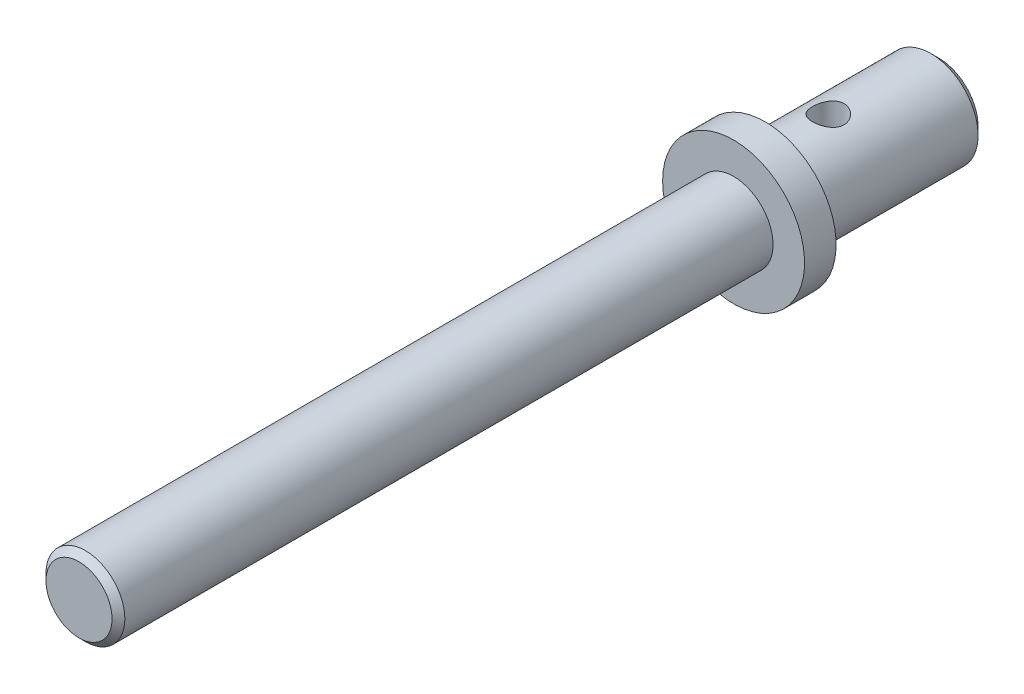
ISO-10303-21;
HEADER;
FILE_DESCRIPTION(('STEP AP214'),'2;1');
FILE_NAME('part.step','',(''),(''),'','','');
FILE_SCHEMA(('AUTOMOTIVE_DESIGN { 1 0 10303 214 1 1 1 1 }'));
ENDSEC;
DATA;
#1=APPLICATION_CONTEXT('core data for automotive mechanical design processes');
#2=APPLICATION_PROTOCOL_DEFINITION('international standard','automotive_design',2000,#1);
#3=PRODUCT_CONTEXT('',#1,'mechanical');
#4=PRODUCT('Part','Part','',(#3));
#5=PRODUCT_RELATED_PRODUCT_CATEGORY('part','',(#4));
#6=PRODUCT_DEFINITION_FORMATION('','',#4);
#7=PRODUCT_DEFINITION_CONTEXT('part definition',#1,'design');
#8=PRODUCT_DEFINITION('design','',#6,#7);
#9=PRODUCT_DEFINITION_SHAPE('','',#8);
#10=(LENGTH_UNIT() NAMED_UNIT(*) SI_UNIT(.MILLI.,.METRE.));
#11=(NAMED_UNIT(*) PLANE_ANGLE_UNIT() SI_UNIT($,.RADIAN.));
#12=(NAMED_UNIT(*) SI_UNIT($,.STERADIAN.) SOLID_ANGLE_UNIT());
#13=UNCERTAINTY_MEASURE_WITH_UNIT(LENGTH_MEASURE(1.E-05),#10,'distance_accuracy_value','');
#14=(GEOMETRIC_REPRESENTATION_CONTEXT(3) GLOBAL_UNCERTAINTY_ASSIGNED_CONTEXT((#13)) GLOBAL_UNIT_ASSIGNED_CONTEXT((#10,
#11,#12)) REPRESENTATION_CONTEXT('',''));
#15=CARTESIAN_POINT('',(0.,0.,0.));
#16=DIRECTION('',(0.,0.,1.));
#17=DIRECTION('',(1.,0.,0.));
#18=AXIS2_PLACEMENT_3D('',#15,#16,#17);
#19=CARTESIAN_POINT('',(0.,0.,-83.));
#20=DIRECTION('',(0.,0.,1.));
#21=DIRECTION('',(1.,0.,0.));
#22=AXIS2_PLACEMENT_3D('',#19,#20,#21);
#23=CYLINDRICAL_SURFACE('',#22,5.);
#24=CARTESIAN_POINT('',(0.,0.,-0.811999999999986));
#25=DIRECTION('',(0.,0.,-1.));
#26=DIRECTION('',(-1.,0.,0.));
#27=AXIS2_PLACEMENT_3D('',#24,#25,#26);
#28=CIRCLE('',#27,5.);
#29=CARTESIAN_POINT('',(-5.,0.,-0.811999999999986));
#30=VERTEX_POINT('',#29);
#31=EDGE_CURVE('E68',#30,#30,#28,.T.);
#32=ORIENTED_EDGE('',*,*,#31,.T.);
#33=EDGE_LOOP('',(#32));
#34=FACE_BOUND('',#33,.T.);
#35=CARTESIAN_POINT('',(0.,0.,-83.));
#36=DIRECTION('',(0.,0.,1.));
#37=DIRECTION('',(1.,0.,0.));
#38=AXIS2_PLACEMENT_3D('',#35,#36,#37);
#39=CIRCLE('',#38,5.);
#40=CARTESIAN_POINT('',(5.,0.,-83.));
#41=VERTEX_POINT('',#40);
#42=EDGE_CURVE('E134',#41,#41,#39,.T.);
#43=ORIENTED_EDGE('',*,*,#42,.T.);
#44=EDGE_LOOP('',(#43));
#45=FACE_BOUND('',#44,.T.);
#46=ADVANCED_FACE('F49',(#34,#45),#23,.T.);
#47=CARTESIAN_POINT('',(0.,0.,0.));
#48=DIRECTION('',(0.,0.,-1.));
#49=DIRECTION('',(-1.,0.,0.));
#50=AXIS2_PLACEMENT_3D('',#47,#48,#49);
#51=CONICAL_SURFACE('',#50,4.188,0.785398163397455);
#52=ORIENTED_EDGE('',*,*,#31,.F.);
#53=EDGE_LOOP('',(#52));
#54=FACE_BOUND('',#53,.T.);
#55=CARTESIAN_POINT('',(0.,0.,0.));
#56=DIRECTION('',(0.,0.,-1.));
#57=DIRECTION('',(-1.,0.,0.));
#58=AXIS2_PLACEMENT_3D('',#55,#56,#57);
#59=CIRCLE('',#58,4.188);
#60=CARTESIAN_POINT('',(-4.188,0.,0.));
#61=VERTEX_POINT('',#60);
#62=EDGE_CURVE('E139',#61,#61,#59,.T.);
#63=ORIENTED_EDGE('',*,*,#62,.T.);
#64=EDGE_LOOP('',(#63));
#65=FACE_BOUND('',#64,.T.);
#66=ADVANCED_FACE('F103',(#54,#65),#51,.T.);
#67=CARTESIAN_POINT('',(0.,0.,0.));
#68=DIRECTION('',(0.,0.,1.));
#69=DIRECTION('',(1.,0.,0.));
#70=AXIS2_PLACEMENT_3D('',#67,#68,#69);
#71=PLANE('',#70);
#72=ORIENTED_EDGE('',*,*,#62,.F.);
#73=EDGE_LOOP('',(#72));
#74=FACE_BOUND('',#73,.T.);
#75=ADVANCED_FACE('F108',(#74),#71,.T.);
#76=CARTESIAN_POINT('',(0.,0.,-87.));
#77=DIRECTION('',(0.,0.,1.));
#78=DIRECTION('',(1.,0.,0.));
#79=AXIS2_PLACEMENT_3D('',#76,#77,#78);
#80=CYLINDRICAL_SURFACE('',#79,9.);
#81=CARTESIAN_POINT('',(0.,0.,-87.));
#82=DIRECTION('',(0.,0.,-1.));
#83=DIRECTION('',(-1.,0.,0.));
#84=AXIS2_PLACEMENT_3D('',#81,#82,#83);
#85=CIRCLE('',#84,9.);
#86=CARTESIAN_POINT('',(-9.,0.,-87.));
#87=VERTEX_POINT('',#86);
#88=EDGE_CURVE('E132',#87,#87,#85,.T.);
#89=ORIENTED_EDGE('',*,*,#88,.F.);
#90=EDGE_LOOP('',(#89));
#91=FACE_BOUND('',#90,.T.);
#92=CARTESIAN_POINT('',(0.,0.,-83.));
#93=DIRECTION('',(0.,0.,-1.));
#94=DIRECTION('',(-1.,0.,0.));
#95=AXIS2_PLACEMENT_3D('',#92,#93,#94);
#96=CIRCLE('',#95,9.);
#97=CARTESIAN_POINT('',(-9.,0.,-83.));
#98=VERTEX_POINT('',#97);
#99=EDGE_CURVE('E80',#98,#98,#96,.T.);
#100=ORIENTED_EDGE('',*,*,#99,.T.);
#101=EDGE_LOOP('',(#100));
#102=FACE_BOUND('',#101,.T.);
#103=ADVANCED_FACE('F115',(#91,#102),#80,.T.);
#104=CARTESIAN_POINT('',(0.,0.,-87.));
#105=DIRECTION('',(0.,0.,-1.));
#106=DIRECTION('',(-1.,0.,0.));
#107=AXIS2_PLACEMENT_3D('',#104,#105,#106);
#108=PLANE('',#107);
#109=CARTESIAN_POINT('',(0.,0.,-87.));
#110=DIRECTION('',(0.,0.,-1.));
#111=DIRECTION('',(-1.,0.,0.));
#112=AXIS2_PLACEMENT_3D('',#109,#110,#111);
#113=CIRCLE('',#112,6.);
#114=CARTESIAN_POINT('',(-6.,0.,-87.));
#115=VERTEX_POINT('',#114);
#116=EDGE_CURVE('E63',#115,#115,#113,.T.);
#117=ORIENTED_EDGE('',*,*,#116,.F.);
#118=EDGE_LOOP('',(#117));
#119=FACE_BOUND('',#118,.T.);
#120=ORIENTED_EDGE('',*,*,#88,.T.);
#121=EDGE_LOOP('',(#120));
#122=FACE_BOUND('',#121,.T.);
#123=ADVANCED_FACE('F120',(#119,#122),#108,.T.);
#124=CARTESIAN_POINT('',(0.,0.,-83.));
#125=DIRECTION('',(0.,0.,-1.));
#126=DIRECTION('',(-1.,0.,0.));
#127=AXIS2_PLACEMENT_3D('',#124,#125,#126);
#128=PLANE('',#127);
#129=ORIENTED_EDGE('',*,*,#42,.F.);
#130=EDGE_LOOP('',(#129));
#131=FACE_BOUND('',#130,.T.);
#132=ORIENTED_EDGE('',*,*,#99,.F.);
#133=EDGE_LOOP('',(#132));
#134=FACE_BOUND('',#133,.T.);
#135=ADVANCED_FACE('F101',(#131,#134),#128,.F.);
#136=CARTESIAN_POINT('',(0.,0.,-109.));
#137=DIRECTION('',(0.,0.,1.));
#138=DIRECTION('',(1.,0.,0.));
#139=AXIS2_PLACEMENT_3D('',#136,#137,#138);
#140=CYLINDRICAL_SURFACE('',#139,6.);
#141=CARTESIAN_POINT('',(0.,0.,-108.));
#142=DIRECTION('',(0.,0.,-1.));
#143=DIRECTION('',(-1.,0.,0.));
#144=AXIS2_PLACEMENT_3D('',#141,#142,#143);
#145=CIRCLE('',#144,6.);
#146=CARTESIAN_POINT('',(-6.,0.,-108.));
#147=VERTEX_POINT('',#146);
#148=EDGE_CURVE('E10',#147,#147,#145,.F.);
#149=ORIENTED_EDGE('',*,*,#148,.T.);
#150=EDGE_LOOP('',(#149));
#151=FACE_BOUND('',#150,.T.);
#152=CARTESIAN_POINT('',(0.,-6.,-93.));
#153=CARTESIAN_POINT('',(0.109126725773447,-6.00000030601888,-92.9999994925367));
#154=CARTESIAN_POINT('',(0.218250389077101,-5.9969953901509,-93.0089605322544));
#155=CARTESIAN_POINT('',(0.433283521745946,-5.98530420406562,-93.0444582176344));
#156=CARTESIAN_POINT('',(0.539192656237638,-5.97661734404305,-93.0709966878978));
#157=CARTESIAN_POINT('',(0.744665579003554,-5.95450615812885,-93.1406384867681));
#158=CARTESIAN_POINT('',(0.844239651772069,-5.94108975461707,-93.1837141249185));
#159=CARTESIAN_POINT('',(1.03474987361065,-5.91088891434684,-93.2850823456767));
#160=CARTESIAN_POINT('',(1.12568431391741,-5.89410381335556,-93.3433779300052));
#161=CARTESIAN_POINT('',(1.29948335004454,-5.8582818888601,-93.4756516097175));
#162=CARTESIAN_POINT('',(1.38200740059663,-5.8391911292757,-93.550062468521));
#163=CARTESIAN_POINT('',(1.53366538540417,-5.80120629566243,-93.7115343094131));
#164=CARTESIAN_POINT('',(1.60279637097893,-5.78231226581098,-93.798598069857));
#165=CARTESIAN_POINT('',(1.72764988445572,-5.74626664954547,-93.9859702303929));
#166=CARTESIAN_POINT('',(1.78292971644207,-5.72918078551376,-94.0865874794642));
#167=CARTESIAN_POINT('',(1.87563774775545,-5.69950610837202,-94.2963521889171));
#168=CARTESIAN_POINT('',(1.91307139477354,-5.68691592321491,-94.4054970343255));
#169=CARTESIAN_POINT('',(1.96774692301834,-5.66822606538754,-94.6253464429934));
#170=CARTESIAN_POINT('',(1.98562689654355,-5.66192191539222,-94.7358744169781));
#171=CARTESIAN_POINT('',(2.00268224666896,-5.65591313259015,-94.9585275083118));
#172=CARTESIAN_POINT('',(2.00186340320944,-5.6562064604546,-95.0706521214184));
#173=CARTESIAN_POINT('',(1.98203980740684,-5.6631803001636,-95.2878732608881));
#174=CARTESIAN_POINT('',(1.963867826334,-5.66956831735066,-95.3930568058381));
#175=CARTESIAN_POINT('',(1.91121232569884,-5.68753315449102,-95.5987868392137));
#176=CARTESIAN_POINT('',(1.87672685318375,-5.69911059568215,-95.6993327708701));
#177=CARTESIAN_POINT('',(1.79187811612043,-5.72635822262497,-95.8948254991829));
#178=CARTESIAN_POINT('',(1.74126809741453,-5.74209131586235,-95.989656050939));
#179=CARTESIAN_POINT('',(1.62577821260629,-5.77585117151453,-96.1697418165595));
#180=CARTESIAN_POINT('',(1.56089422472802,-5.79387859580927,-96.2549942538668));
#181=CARTESIAN_POINT('',(1.41469866536448,-5.83134658335482,-96.4181831963216));
#182=CARTESIAN_POINT('',(1.33270630015262,-5.85081178709686,-96.4955053890181));
#183=CARTESIAN_POINT('',(1.15667913994013,-5.88813876774073,-96.6354625333268));
#184=CARTESIAN_POINT('',(1.06264319132163,-5.90600039076135,-96.698096076329));
#185=CARTESIAN_POINT('',(0.863895226092539,-5.93834215875587,-96.8073926004701));
#186=CARTESIAN_POINT('',(0.759086552832674,-5.95278700016079,-96.8538909826815));
#187=CARTESIAN_POINT('',(0.542538166729013,-5.9764113428887,-96.9284063479114));
#188=CARTESIAN_POINT('',(0.430800876309904,-5.98559267309759,-96.9564297508469));
#189=CARTESIAN_POINT('',(0.208767659058604,-5.99735254142881,-96.9921113320447));
#190=CARTESIAN_POINT('',(0.098619199729688,-6.00020003667456,-97.0005996183455));
#191=CARTESIAN_POINT('',(-0.121550139920479,-5.99977805389655,-96.9993346528031));
#192=CARTESIAN_POINT('',(-0.231571038639305,-5.99650960838725,-96.9895844800403));
#193=CARTESIAN_POINT('',(-0.445039732608515,-5.98440049434209,-96.9527761845281));
#194=CARTESIAN_POINT('',(-0.54858561366969,-5.97572397422385,-96.926227587901));
#195=CARTESIAN_POINT('',(-0.74971191715915,-5.9538369366014,-96.8572131110666));
#196=CARTESIAN_POINT('',(-0.847291577017217,-5.9406258409335,-96.8147452010644));
#197=CARTESIAN_POINT('',(-1.03657659278655,-5.91057862574579,-96.7138591363184));
#198=CARTESIAN_POINT('',(-1.1280599184343,-5.89365629511572,-96.6550508134337));
#199=CARTESIAN_POINT('',(-1.30012966027118,-5.85810507832525,-96.523611699973));
#200=CARTESIAN_POINT('',(-1.38071273559116,-5.83947567187655,-96.4509766879365));
#201=CARTESIAN_POINT('',(-1.5325050156126,-5.80153695960889,-96.2900424979868));
#202=CARTESIAN_POINT('',(-1.60312193849155,-5.78223522174856,-96.2011815461463));
#203=CARTESIAN_POINT('',(-1.72851504464715,-5.74599946589417,-96.0124568643783));
#204=CARTESIAN_POINT('',(-1.78329109586203,-5.72906546764005,-95.9125930427319));
#205=CARTESIAN_POINT('',(-1.87519386083272,-5.69964783582767,-95.7046539694202));
#206=CARTESIAN_POINT('',(-1.91235626433005,-5.68715521585958,-95.5965958416625));
#207=CARTESIAN_POINT('',(-1.96778933351872,-5.66821664612899,-95.3752426999117));
#208=CARTESIAN_POINT('',(-1.98606850990789,-5.66176797247279,-95.2619500691913));
#209=CARTESIAN_POINT('',(-2.00255256495469,-5.65595717748354,-95.0396058079182));
#210=CARTESIAN_POINT('',(-2.00174051461681,-5.6562480051483,-94.9306353194264));
#211=CARTESIAN_POINT('',(-1.98248458689739,-5.66302539647735,-94.7144698501559));
#212=CARTESIAN_POINT('',(-1.96404175891718,-5.66951159138723,-94.6072747640898));
#213=CARTESIAN_POINT('',(-1.9107436262587,-5.68769048609783,-94.3997286739951));
#214=CARTESIAN_POINT('',(-1.87620669203104,-5.69928196044955,-94.299286349991));
#215=CARTESIAN_POINT('',(-1.7919587315195,-5.72632797636937,-94.1055451861235));
#216=CARTESIAN_POINT('',(-1.74224433710761,-5.74178337526786,-94.012247937624));
#217=CARTESIAN_POINT('',(-1.62652138516686,-5.77565658452093,-93.8310326601542));
#218=CARTESIAN_POINT('',(-1.55989648552916,-5.79417423284274,-93.7435269962032));
#219=CARTESIAN_POINT('',(-1.4132857662713,-5.83166712566506,-93.5806203732316));
#220=CARTESIAN_POINT('',(-1.33329616890297,-5.85064249824745,-93.5052228486238));
#221=CARTESIAN_POINT('',(-1.15848311384138,-5.88780061051088,-93.3657111754216));
#222=CARTESIAN_POINT('',(-1.06320302699946,-5.90592363602513,-93.302151304498));
#223=CARTESIAN_POINT('',(-0.862714714813249,-5.93851982345224,-93.1920191422987));
#224=CARTESIAN_POINT('',(-0.757509036264697,-5.9529939181586,-93.1454425081559));
#225=CARTESIAN_POINT('',(-0.544987294401952,-5.97611030137084,-93.0725567350227));
#226=CARTESIAN_POINT('',(-0.437975515352818,-5.98498424845045,-93.0454350674732));
#227=CARTESIAN_POINT('',(-0.220640832020494,-5.99692814128444,-93.0091594386457));
#228=CARTESIAN_POINT('',(-0.110318851137493,-5.9999996906381,-93.0000005130069));
#229=CARTESIAN_POINT('',(0.,-6.,-93.));
#230=B_SPLINE_CURVE_WITH_KNOTS('',3,(#152,#153,#154,#155,#156,#157,#158,#159,#160,#161,#162,
#163,#164,#165,#166,#167,#168,#169,#170,#171,#172,#173,#174,#175,#176,#177,#178,#179,#180,#181,
#182,#183,#184,#185,#186,#187,#188,#189,#190,#191,#192,#193,#194,#195,#196,#197,#198,#199,#200,
#201,#202,#203,#204,#205,#206,#207,#208,#209,#210,#211,#212,#213,#214,#215,#216,#217,#218,#219,
#220,#221,#222,#223,#224,#225,#226,#227,#228,#229),.UNSPECIFIED.,.T.,.F.,(4,2,2,2,2,2,2,2,2,2,2,
2,2,2,2,2,2,2,2,2,2,2,2,2,2,2,2,2,2,2,2,2,2,2,2,2,2,2,4),(0.,0.326974212052022,
0.653982370535044,0.980445345740549,1.30697275559821,1.64369368565513,1.98048866575061,
2.32696769646942,2.67334089385668,3.00803851483684,3.34263267974974,3.66193653102563,
3.98127861710964,4.30576342310263,4.63034205116417,4.97186611622736,5.31342291933238,
5.65836811300717,6.00319337754419,6.33307166350342,6.66289426328356,6.98316315956429,
7.3034729056821,7.63220799687477,7.96104361643786,8.30482045761506,8.64860016469995,
8.99168027653544,9.33460569411683,9.65991332128518,9.98520158702753,10.3043117416084,
10.6234927635196,10.9566013338361,11.2898042224756,11.6359932167021,11.9820936230492,
12.3127311674763,12.6432773207628),.UNSPECIFIED.);
#231=CARTESIAN_POINT('',(0.,-6.,-93.));
#232=VERTEX_POINT('',#231);
#233=EDGE_CURVE('E71',#232,#232,#230,.T.);
#234=ORIENTED_EDGE('',*,*,#233,.T.);
#235=EDGE_LOOP('',(#234));
#236=FACE_BOUND('',#235,.T.);
#237=CARTESIAN_POINT('',(0.,6.,-93.));
#238=CARTESIAN_POINT('',(-0.109126725773447,6.00000030601888,-92.9999994925367));
#239=CARTESIAN_POINT('',(-0.218250389077101,5.9969953901509,-93.0089605322544));
#240=CARTESIAN_POINT('',(-0.433283521745946,5.98530420406562,-93.0444582176344));
#241=CARTESIAN_POINT('',(-0.539192656237638,5.97661734404305,-93.0709966878978));
#242=CARTESIAN_POINT('',(-0.744665579003554,5.95450615812885,-93.1406384867681));
#243=CARTESIAN_POINT('',(-0.844239651772069,5.94108975461707,-93.1837141249185));
#244=CARTESIAN_POINT('',(-1.03474987361065,5.91088891434684,-93.2850823456767));
#245=CARTESIAN_POINT('',(-1.12568431391741,5.89410381335556,-93.3433779300052));
#246=CARTESIAN_POINT('',(-1.29948335004454,5.8582818888601,-93.4756516097175));
#247=CARTESIAN_POINT('',(-1.38200740059663,5.8391911292757,-93.550062468521));
#248=CARTESIAN_POINT('',(-1.53366538540417,5.80120629566243,-93.7115343094131));
#249=CARTESIAN_POINT('',(-1.60279637097893,5.78231226581098,-93.798598069857));
#250=CARTESIAN_POINT('',(-1.72764988445572,5.74626664954547,-93.9859702303929));
#251=CARTESIAN_POINT('',(-1.78292971644207,5.72918078551376,-94.0865874794642));
#252=CARTESIAN_POINT('',(-1.87563774775545,5.69950610837202,-94.2963521889171));
#253=CARTESIAN_POINT('',(-1.91307139477354,5.68691592321491,-94.4054970343255));
#254=CARTESIAN_POINT('',(-1.96774692301834,5.66822606538754,-94.6253464429934));
#255=CARTESIAN_POINT('',(-1.98562689654355,5.66192191539222,-94.7358744169781));
#256=CARTESIAN_POINT('',(-2.00268224666896,5.65591313259015,-94.9585275083118));
#257=CARTESIAN_POINT('',(-2.00186340320944,5.6562064604546,-95.0706521214184));
#258=CARTESIAN_POINT('',(-1.98203980740684,5.6631803001636,-95.2878732608881));
#259=CARTESIAN_POINT('',(-1.963867826334,5.66956831735066,-95.3930568058381));
#260=CARTESIAN_POINT('',(-1.91121232569884,5.68753315449102,-95.5987868392137));
#261=CARTESIAN_POINT('',(-1.87672685318375,5.69911059568215,-95.6993327708701));
#262=CARTESIAN_POINT('',(-1.79187811612043,5.72635822262497,-95.8948254991829));
#263=CARTESIAN_POINT('',(-1.74126809741453,5.74209131586235,-95.989656050939));
#264=CARTESIAN_POINT('',(-1.62577821260629,5.77585117151453,-96.1697418165595));
#265=CARTESIAN_POINT('',(-1.56089422472802,5.79387859580927,-96.2549942538668));
#266=CARTESIAN_POINT('',(-1.41469866536448,5.83134658335482,-96.4181831963216));
#267=CARTESIAN_POINT('',(-1.33270630015262,5.85081178709686,-96.4955053890181));
#268=CARTESIAN_POINT('',(-1.15667913994013,5.88813876774073,-96.6354625333268));
#269=CARTESIAN_POINT('',(-1.06264319132163,5.90600039076135,-96.698096076329));
#270=CARTESIAN_POINT('',(-0.863895226092539,5.93834215875587,-96.8073926004701));
#271=CARTESIAN_POINT('',(-0.759086552832674,5.95278700016079,-96.8538909826815));
#272=CARTESIAN_POINT('',(-0.542538166729013,5.9764113428887,-96.9284063479114));
#273=CARTESIAN_POINT('',(-0.430800876309904,5.98559267309759,-96.9564297508469));
#274=CARTESIAN_POINT('',(-0.208767659058604,5.99735254142881,-96.9921113320447));
#275=CARTESIAN_POINT('',(-0.098619199729688,6.00020003667456,-97.0005996183455));
#276=CARTESIAN_POINT('',(0.121550139920479,5.99977805389655,-96.9993346528031));
#277=CARTESIAN_POINT('',(0.231571038639305,5.99650960838725,-96.9895844800403));
#278=CARTESIAN_POINT('',(0.445039732608515,5.98440049434209,-96.9527761845281));
#279=CARTESIAN_POINT('',(0.54858561366969,5.97572397422385,-96.926227587901));
#280=CARTESIAN_POINT('',(0.74971191715915,5.9538369366014,-96.8572131110666));
#281=CARTESIAN_POINT('',(0.847291577017217,5.9406258409335,-96.8147452010644));
#282=CARTESIAN_POINT('',(1.03657659278655,5.91057862574579,-96.7138591363184));
#283=CARTESIAN_POINT('',(1.1280599184343,5.89365629511572,-96.6550508134337));
#284=CARTESIAN_POINT('',(1.30012966027118,5.85810507832525,-96.523611699973));
#285=CARTESIAN_POINT('',(1.38071273559116,5.83947567187655,-96.4509766879365));
#286=CARTESIAN_POINT('',(1.5325050156126,5.80153695960889,-96.2900424979868));
#287=CARTESIAN_POINT('',(1.60312193849155,5.78223522174856,-96.2011815461463));
#288=CARTESIAN_POINT('',(1.72851504464715,5.74599946589417,-96.0124568643783));
#289=CARTESIAN_POINT('',(1.78329109586203,5.72906546764005,-95.9125930427319));
#290=CARTESIAN_POINT('',(1.87519386083272,5.69964783582767,-95.7046539694202));
#291=CARTESIAN_POINT('',(1.91235626433005,5.68715521585958,-95.5965958416625));
#292=CARTESIAN_POINT('',(1.96778933351872,5.66821664612899,-95.3752426999117));
#293=CARTESIAN_POINT('',(1.98606850990789,5.66176797247279,-95.2619500691913));
#294=CARTESIAN_POINT('',(2.00255256495469,5.65595717748354,-95.0396058079182));
#295=CARTESIAN_POINT('',(2.00174051461681,5.6562480051483,-94.9306353194264));
#296=CARTESIAN_POINT('',(1.98248458689739,5.66302539647735,-94.7144698501559));
#297=CARTESIAN_POINT('',(1.96404175891718,5.66951159138723,-94.6072747640898));
#298=CARTESIAN_POINT('',(1.9107436262587,5.68769048609783,-94.3997286739951));
#299=CARTESIAN_POINT('',(1.87620669203104,5.69928196044955,-94.299286349991));
#300=CARTESIAN_POINT('',(1.7919587315195,5.72632797636937,-94.1055451861235));
#301=CARTESIAN_POINT('',(1.74224433710761,5.74178337526786,-94.012247937624));
#302=CARTESIAN_POINT('',(1.62652138516686,5.77565658452093,-93.8310326601542));
#303=CARTESIAN_POINT('',(1.55989648552916,5.79417423284274,-93.7435269962032));
#304=CARTESIAN_POINT('',(1.4132857662713,5.83166712566506,-93.5806203732316));
#305=CARTESIAN_POINT('',(1.33329616890297,5.85064249824745,-93.5052228486238));
#306=CARTESIAN_POINT('',(1.15848311384138,5.88780061051088,-93.3657111754216));
#307=CARTESIAN_POINT('',(1.06320302699946,5.90592363602513,-93.302151304498));
#308=CARTESIAN_POINT('',(0.862714714813249,5.93851982345224,-93.1920191422987));
#309=CARTESIAN_POINT('',(0.757509036264697,5.9529939181586,-93.1454425081559));
#310=CARTESIAN_POINT('',(0.544987294401952,5.97611030137084,-93.0725567350227));
#311=CARTESIAN_POINT('',(0.437975515352818,5.98498424845045,-93.0454350674732));
#312=CARTESIAN_POINT('',(0.220640832020494,5.99692814128444,-93.0091594386457));
#313=CARTESIAN_POINT('',(0.110318851137493,5.9999996906381,-93.0000005130069));
#314=CARTESIAN_POINT('',(0.,6.,-93.));
#315=B_SPLINE_CURVE_WITH_KNOTS('',3,(#237,#238,#239,#240,#241,#242,#243,#244,#245,#246,#247,
#248,#249,#250,#251,#252,#253,#254,#255,#256,#257,#258,#259,#260,#261,#262,#263,#264,#265,#266,
#267,#268,#269,#270,#271,#272,#273,#274,#275,#276,#277,#278,#279,#280,#281,#282,#283,#284,#285,
#286,#287,#288,#289,#290,#291,#292,#293,#294,#295,#296,#297,#298,#299,#300,#301,#302,#303,#304,
#305,#306,#307,#308,#309,#310,#311,#312,#313,#314),.UNSPECIFIED.,.T.,.F.,(4,2,2,2,2,2,2,2,2,2,2,
2,2,2,2,2,2,2,2,2,2,2,2,2,2,2,2,2,2,2,2,2,2,2,2,2,2,2,4),(0.,0.326974212052022,
0.653982370535044,0.980445345740549,1.30697275559821,1.64369368565513,1.98048866575061,
2.32696769646942,2.67334089385668,3.00803851483684,3.34263267974974,3.66193653102563,
3.98127861710964,4.30576342310263,4.63034205116417,4.97186611622736,5.31342291933238,
5.65836811300717,6.00319337754419,6.33307166350342,6.66289426328356,6.98316315956429,
7.3034729056821,7.63220799687477,7.96104361643786,8.30482045761506,8.64860016469995,
8.99168027653544,9.33460569411683,9.65991332128518,9.98520158702753,10.3043117416084,
10.6234927635196,10.9566013338361,11.2898042224756,11.6359932167021,11.9820936230492,
12.3127311674763,12.6432773207628),.UNSPECIFIED.);
#316=CARTESIAN_POINT('',(0.,6.,-93.));
#317=VERTEX_POINT('',#316);
#318=EDGE_CURVE('E81',#317,#317,#315,.T.);
#319=ORIENTED_EDGE('',*,*,#318,.T.);
#320=EDGE_LOOP('',(#319));
#321=FACE_BOUND('',#320,.T.);
#322=ORIENTED_EDGE('',*,*,#116,.T.);
#323=EDGE_LOOP('',(#322));
#324=FACE_BOUND('',#323,.T.);
#325=ADVANCED_FACE('F86',(#151,#236,#321,#324),#140,.T.);
#326=CARTESIAN_POINT('',(0.,0.,-109.));
#327=DIRECTION('',(0.,0.,-1.));
#328=DIRECTION('',(-1.,0.,0.));
#329=AXIS2_PLACEMENT_3D('',#326,#327,#328);
#330=PLANE('',#329);
#331=CARTESIAN_POINT('',(0.,0.,-109.));
#332=DIRECTION('',(0.,0.,-1.));
#333=DIRECTION('',(-1.,0.,0.));
#334=AXIS2_PLACEMENT_3D('',#331,#332,#333);
#335=CIRCLE('',#334,5.);
#336=CARTESIAN_POINT('',(-5.,0.,-109.));
#337=VERTEX_POINT('',#336);
#338=EDGE_CURVE('E58',#337,#337,#335,.T.);
#339=ORIENTED_EDGE('',*,*,#338,.T.);
#340=EDGE_LOOP('',(#339));
#341=FACE_BOUND('',#340,.T.);
#342=ADVANCED_FACE('F93',(#341),#330,.T.);
#343=CARTESIAN_POINT('',(0.,-9.,-95.));
#344=DIRECTION('',(0.,1.,0.));
#345=DIRECTION('',(0.,0.,1.));
#346=AXIS2_PLACEMENT_3D('',#343,#344,#345);
#347=CYLINDRICAL_SURFACE('',#346,2.00000000000001);
#348=ORIENTED_EDGE('',*,*,#318,.F.);
#349=EDGE_LOOP('',(#348));
#350=FACE_BOUND('',#349,.T.);
#351=ORIENTED_EDGE('',*,*,#233,.F.);
#352=EDGE_LOOP('',(#351));
#353=FACE_BOUND('',#352,.T.);
#354=ADVANCED_FACE('F90',(#350,#353),#347,.F.);
#355=CARTESIAN_POINT('',(0.,0.,-109.));
#356=DIRECTION('',(0.,0.,1.));
#357=DIRECTION('',(1.,0.,0.));
#358=AXIS2_PLACEMENT_3D('',#355,#356,#357);
#359=CONICAL_SURFACE('',#358,5.,0.785398163397446);
#360=ORIENTED_EDGE('',*,*,#148,.F.);
#361=EDGE_LOOP('',(#360));
#362=FACE_BOUND('',#361,.T.);
#363=ORIENTED_EDGE('',*,*,#338,.F.);
#364=EDGE_LOOP('',(#363));
#365=FACE_BOUND('',#364,.T.);
#366=ADVANCED_FACE('F52',(#362,#365),#359,.T.);
#367=CLOSED_SHELL('',(#46,#66,#75,#103,#123,#135,#325,#342,#354,#366));
#368=MANIFOLD_SOLID_BREP('B2',#367);
#369=ADVANCED_BREP_SHAPE_REPRESENTATION('',(#18,#368),#14);
#370=SHAPE_DEFINITION_REPRESENTATION(#9,#369);
ENDSEC;
END-ISO-10303-21;
